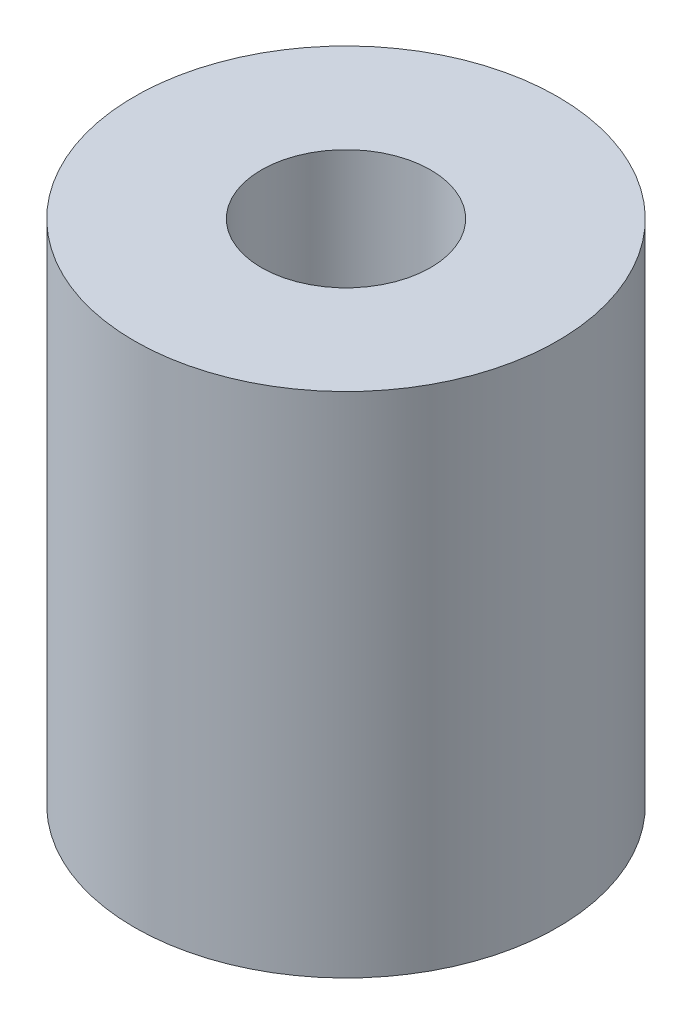
ISO-10303-21;
HEADER;
FILE_DESCRIPTION(('STEP AP214'),'2;1');
FILE_NAME('part.step','',(''),(''),'','','');
FILE_SCHEMA(('AUTOMOTIVE_DESIGN { 1 0 10303 214 1 1 1 1 }'));
ENDSEC;
DATA;
#1=APPLICATION_CONTEXT('core data for automotive mechanical design processes');
#2=APPLICATION_PROTOCOL_DEFINITION('international standard','automotive_design',2000,#1);
#3=PRODUCT_CONTEXT('',#1,'mechanical');
#4=PRODUCT('Part','Part','',(#3));
#5=PRODUCT_RELATED_PRODUCT_CATEGORY('part','',(#4));
#6=PRODUCT_DEFINITION_FORMATION('','',#4);
#7=PRODUCT_DEFINITION_CONTEXT('part definition',#1,'design');
#8=PRODUCT_DEFINITION('design','',#6,#7);
#9=PRODUCT_DEFINITION_SHAPE('','',#8);
#10=(LENGTH_UNIT() NAMED_UNIT(*) SI_UNIT(.MILLI.,.METRE.));
#11=(NAMED_UNIT(*) PLANE_ANGLE_UNIT() SI_UNIT($,.RADIAN.));
#12=(NAMED_UNIT(*) SI_UNIT($,.STERADIAN.) SOLID_ANGLE_UNIT());
#13=UNCERTAINTY_MEASURE_WITH_UNIT(LENGTH_MEASURE(1.E-05),#10,'distance_accuracy_value','');
#14=(GEOMETRIC_REPRESENTATION_CONTEXT(3) GLOBAL_UNCERTAINTY_ASSIGNED_CONTEXT((#13)) GLOBAL_UNIT_ASSIGNED_CONTEXT((#10,
#11,#12)) REPRESENTATION_CONTEXT('',''));
#15=CARTESIAN_POINT('',(0.,0.,0.));
#16=DIRECTION('',(0.,0.,1.));
#17=DIRECTION('',(1.,0.,0.));
#18=AXIS2_PLACEMENT_3D('',#15,#16,#17);
#19=CARTESIAN_POINT('',(0.,15.,0.));
#20=DIRECTION('',(0.,1.,0.));
#21=DIRECTION('',(0.,0.,1.));
#22=AXIS2_PLACEMENT_3D('',#19,#20,#21);
#23=PLANE('',#22);
#24=CARTESIAN_POINT('',(0.,15.,0.));
#25=DIRECTION('',(0.,1.,0.));
#26=DIRECTION('',(0.,0.,1.));
#27=AXIS2_PLACEMENT_3D('',#24,#25,#26);
#28=CIRCLE('',#27,6.25);
#29=CARTESIAN_POINT('',(0.,15.,6.25));
#30=VERTEX_POINT('',#29);
#31=EDGE_CURVE('E10',#30,#30,#28,.T.);
#32=ORIENTED_EDGE('',*,*,#31,.T.);
#33=EDGE_LOOP('',(#32));
#34=FACE_BOUND('',#33,.T.);
#35=CARTESIAN_POINT('',(0.,15.,0.));
#36=DIRECTION('',(0.,1.,0.));
#37=DIRECTION('',(0.,0.,1.));
#38=AXIS2_PLACEMENT_3D('',#35,#36,#37);
#39=CIRCLE('',#38,2.5);
#40=CARTESIAN_POINT('',(0.,15.,2.5));
#41=VERTEX_POINT('',#40);
#42=EDGE_CURVE('E49',#41,#41,#39,.T.);
#43=ORIENTED_EDGE('',*,*,#42,.F.);
#44=EDGE_LOOP('',(#43));
#45=FACE_BOUND('',#44,.T.);
#46=ADVANCED_FACE('F38',(#34,#45),#23,.T.);
#47=CARTESIAN_POINT('',(0.,0.,0.));
#48=DIRECTION('',(0.,1.,0.));
#49=DIRECTION('',(0.,0.,1.));
#50=AXIS2_PLACEMENT_3D('',#47,#48,#49);
#51=PLANE('',#50);
#52=CARTESIAN_POINT('',(0.,0.,0.));
#53=DIRECTION('',(0.,1.,0.));
#54=DIRECTION('',(0.,0.,1.));
#55=AXIS2_PLACEMENT_3D('',#52,#53,#54);
#56=CIRCLE('',#55,6.25);
#57=CARTESIAN_POINT('',(0.,0.,6.25));
#58=VERTEX_POINT('',#57);
#59=EDGE_CURVE('E42',#58,#58,#56,.T.);
#60=ORIENTED_EDGE('',*,*,#59,.F.);
#61=EDGE_LOOP('',(#60));
#62=FACE_BOUND('',#61,.T.);
#63=CARTESIAN_POINT('',(0.,0.,0.));
#64=DIRECTION('',(0.,1.,0.));
#65=DIRECTION('',(0.,0.,1.));
#66=AXIS2_PLACEMENT_3D('',#63,#64,#65);
#67=CIRCLE('',#66,2.5);
#68=CARTESIAN_POINT('',(0.,0.,2.5));
#69=VERTEX_POINT('',#68);
#70=EDGE_CURVE('E51',#69,#69,#67,.T.);
#71=ORIENTED_EDGE('',*,*,#70,.T.);
#72=EDGE_LOOP('',(#71));
#73=FACE_BOUND('',#72,.T.);
#74=ADVANCED_FACE('F61',(#62,#73),#51,.F.);
#75=CARTESIAN_POINT('',(0.,15.,0.));
#76=DIRECTION('',(0.,-1.,0.));
#77=DIRECTION('',(0.,0.,-1.));
#78=AXIS2_PLACEMENT_3D('',#75,#76,#77);
#79=CYLINDRICAL_SURFACE('',#78,6.25);
#80=ORIENTED_EDGE('',*,*,#31,.F.);
#81=EDGE_LOOP('',(#80));
#82=FACE_BOUND('',#81,.T.);
#83=ORIENTED_EDGE('',*,*,#59,.T.);
#84=EDGE_LOOP('',(#83));
#85=FACE_BOUND('',#84,.T.);
#86=ADVANCED_FACE('F40',(#82,#85),#79,.T.);
#87=CARTESIAN_POINT('',(0.,15.,0.));
#88=DIRECTION('',(0.,-1.,0.));
#89=DIRECTION('',(0.,0.,-1.));
#90=AXIS2_PLACEMENT_3D('',#87,#88,#89);
#91=CYLINDRICAL_SURFACE('',#90,2.5);
#92=ORIENTED_EDGE('',*,*,#42,.T.);
#93=EDGE_LOOP('',(#92));
#94=FACE_BOUND('',#93,.T.);
#95=ORIENTED_EDGE('',*,*,#70,.F.);
#96=EDGE_LOOP('',(#95));
#97=FACE_BOUND('',#96,.T.);
#98=ADVANCED_FACE('F57',(#94,#97),#91,.F.);
#99=CLOSED_SHELL('',(#46,#74,#86,#98));
#100=MANIFOLD_SOLID_BREP('B2',#99);
#101=ADVANCED_BREP_SHAPE_REPRESENTATION('',(#18,#100),#14);
#102=SHAPE_DEFINITION_REPRESENTATION(#9,#101);
ENDSEC;
END-ISO-10303-21;
